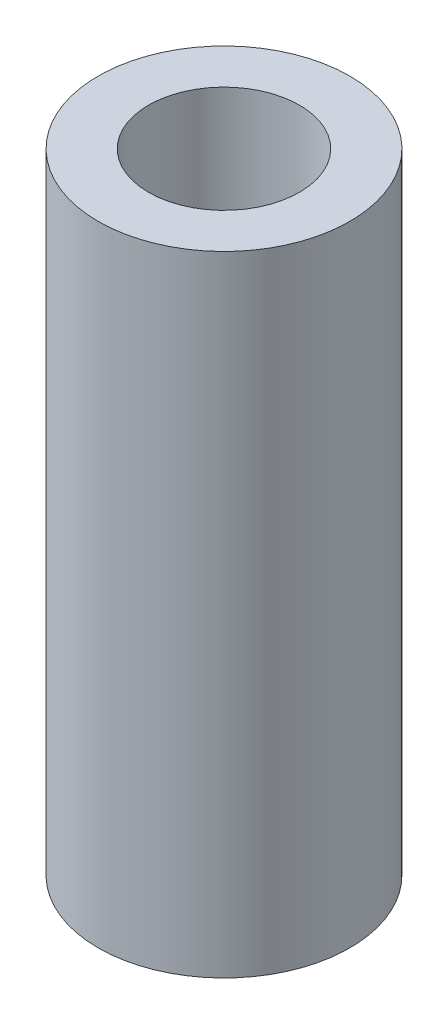
ISO-10303-21;
HEADER;
FILE_DESCRIPTION(('STEP AP214'),'2;1');
FILE_NAME('part.step','',(''),(''),'','','');
FILE_SCHEMA(('AUTOMOTIVE_DESIGN { 1 0 10303 214 1 1 1 1 }'));
ENDSEC;
DATA;
#1=APPLICATION_CONTEXT('core data for automotive mechanical design processes');
#2=APPLICATION_PROTOCOL_DEFINITION('international standard','automotive_design',2000,#1);
#3=PRODUCT_CONTEXT('',#1,'mechanical');
#4=PRODUCT('Part','Part','',(#3));
#5=PRODUCT_RELATED_PRODUCT_CATEGORY('part','',(#4));
#6=PRODUCT_DEFINITION_FORMATION('','',#4);
#7=PRODUCT_DEFINITION_CONTEXT('part definition',#1,'design');
#8=PRODUCT_DEFINITION('design','',#6,#7);
#9=PRODUCT_DEFINITION_SHAPE('','',#8);
#10=(LENGTH_UNIT() NAMED_UNIT(*) SI_UNIT(.MILLI.,.METRE.));
#11=(NAMED_UNIT(*) PLANE_ANGLE_UNIT() SI_UNIT($,.RADIAN.));
#12=(NAMED_UNIT(*) SI_UNIT($,.STERADIAN.) SOLID_ANGLE_UNIT());
#13=UNCERTAINTY_MEASURE_WITH_UNIT(LENGTH_MEASURE(1.E-05),#10,'distance_accuracy_value','');
#14=(GEOMETRIC_REPRESENTATION_CONTEXT(3) GLOBAL_UNCERTAINTY_ASSIGNED_CONTEXT((#13)) GLOBAL_UNIT_ASSIGNED_CONTEXT((#10,
#11,#12)) REPRESENTATION_CONTEXT('',''));
#15=CARTESIAN_POINT('',(0.,0.,0.));
#16=DIRECTION('',(0.,0.,1.));
#17=DIRECTION('',(1.,0.,0.));
#18=AXIS2_PLACEMENT_3D('',#15,#16,#17);
#19=CARTESIAN_POINT('',(0.,6.125,0.));
#20=DIRECTION('',(0.,1.,0.));
#21=DIRECTION('',(0.,0.,1.));
#22=AXIS2_PLACEMENT_3D('',#19,#20,#21);
#23=PLANE('',#22);
#24=CARTESIAN_POINT('',(0.,6.125,0.));
#25=DIRECTION('',(0.,1.,0.));
#26=DIRECTION('',(0.,0.,1.));
#27=AXIS2_PLACEMENT_3D('',#24,#25,#26);
#28=CIRCLE('',#27,2.45);
#29=CARTESIAN_POINT('',(0.,6.125,2.45));
#30=VERTEX_POINT('',#29);
#31=EDGE_CURVE('E10',#30,#30,#28,.T.);
#32=ORIENTED_EDGE('',*,*,#31,.T.);
#33=EDGE_LOOP('',(#32));
#34=FACE_BOUND('',#33,.T.);
#35=CARTESIAN_POINT('',(0.,6.125,0.));
#36=DIRECTION('',(0.,1.,0.));
#37=DIRECTION('',(0.,0.,1.));
#38=AXIS2_PLACEMENT_3D('',#35,#36,#37);
#39=CIRCLE('',#38,1.47);
#40=CARTESIAN_POINT('',(0.,6.125,1.47));
#41=VERTEX_POINT('',#40);
#42=EDGE_CURVE('E44',#41,#41,#39,.T.);
#43=ORIENTED_EDGE('',*,*,#42,.F.);
#44=EDGE_LOOP('',(#43));
#45=FACE_BOUND('',#44,.T.);
#46=ADVANCED_FACE('F33',(#34,#45),#23,.T.);
#47=CARTESIAN_POINT('',(0.,-6.125,0.));
#48=DIRECTION('',(0.,1.,0.));
#49=DIRECTION('',(0.,0.,1.));
#50=AXIS2_PLACEMENT_3D('',#47,#48,#49);
#51=PLANE('',#50);
#52=CARTESIAN_POINT('',(0.,-6.125,0.));
#53=DIRECTION('',(0.,1.,0.));
#54=DIRECTION('',(0.,0.,1.));
#55=AXIS2_PLACEMENT_3D('',#52,#53,#54);
#56=CIRCLE('',#55,2.45);
#57=CARTESIAN_POINT('',(0.,-6.125,2.45));
#58=VERTEX_POINT('',#57);
#59=EDGE_CURVE('E37',#58,#58,#56,.T.);
#60=ORIENTED_EDGE('',*,*,#59,.F.);
#61=EDGE_LOOP('',(#60));
#62=FACE_BOUND('',#61,.T.);
#63=CARTESIAN_POINT('',(0.,-6.125,0.));
#64=DIRECTION('',(0.,1.,0.));
#65=DIRECTION('',(0.,0.,1.));
#66=AXIS2_PLACEMENT_3D('',#63,#64,#65);
#67=CIRCLE('',#66,1.47);
#68=CARTESIAN_POINT('',(0.,-6.125,1.47));
#69=VERTEX_POINT('',#68);
#70=EDGE_CURVE('E46',#69,#69,#67,.T.);
#71=ORIENTED_EDGE('',*,*,#70,.T.);
#72=EDGE_LOOP('',(#71));
#73=FACE_BOUND('',#72,.T.);
#74=ADVANCED_FACE('F56',(#62,#73),#51,.F.);
#75=CARTESIAN_POINT('',(0.,6.125,0.));
#76=DIRECTION('',(0.,-1.,0.));
#77=DIRECTION('',(0.,0.,-1.));
#78=AXIS2_PLACEMENT_3D('',#75,#76,#77);
#79=CYLINDRICAL_SURFACE('',#78,2.45);
#80=ORIENTED_EDGE('',*,*,#31,.F.);
#81=EDGE_LOOP('',(#80));
#82=FACE_BOUND('',#81,.T.);
#83=ORIENTED_EDGE('',*,*,#59,.T.);
#84=EDGE_LOOP('',(#83));
#85=FACE_BOUND('',#84,.T.);
#86=ADVANCED_FACE('F35',(#82,#85),#79,.T.);
#87=CARTESIAN_POINT('',(0.,6.125,0.));
#88=DIRECTION('',(0.,-1.,0.));
#89=DIRECTION('',(0.,0.,-1.));
#90=AXIS2_PLACEMENT_3D('',#87,#88,#89);
#91=CYLINDRICAL_SURFACE('',#90,1.47);
#92=ORIENTED_EDGE('',*,*,#42,.T.);
#93=EDGE_LOOP('',(#92));
#94=FACE_BOUND('',#93,.T.);
#95=ORIENTED_EDGE('',*,*,#70,.F.);
#96=EDGE_LOOP('',(#95));
#97=FACE_BOUND('',#96,.T.);
#98=ADVANCED_FACE('F52',(#94,#97),#91,.F.);
#99=CLOSED_SHELL('',(#46,#74,#86,#98));
#100=MANIFOLD_SOLID_BREP('B2',#99);
#101=ADVANCED_BREP_SHAPE_REPRESENTATION('',(#18,#100),#14);
#102=SHAPE_DEFINITION_REPRESENTATION(#9,#101);
ENDSEC;
END-ISO-10303-21;
